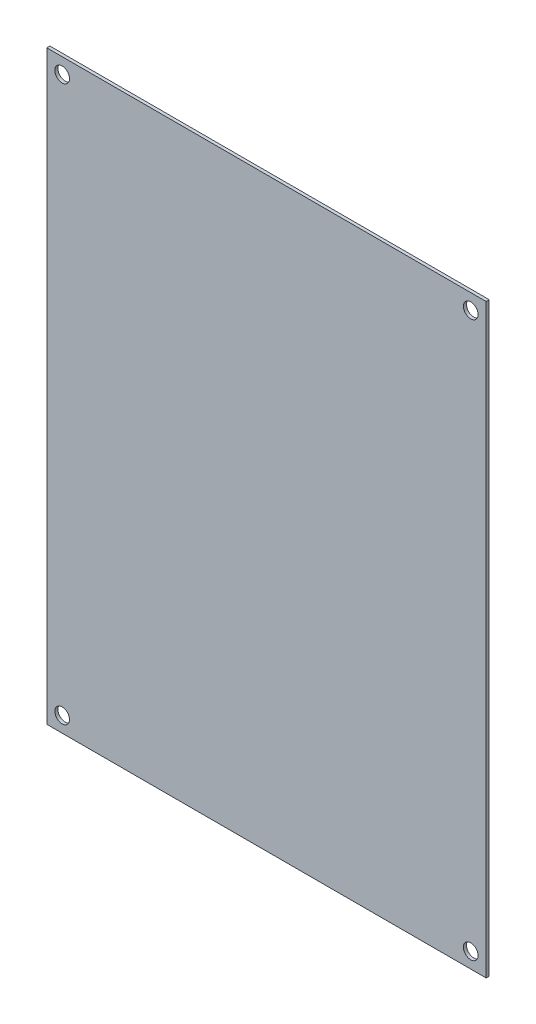
ISO-10303-21;
HEADER;
FILE_DESCRIPTION(('STEP AP214'),'2;1');
FILE_NAME('part.step','',(''),(''),'','','');
FILE_SCHEMA(('AUTOMOTIVE_DESIGN { 1 0 10303 214 1 1 1 1 }'));
ENDSEC;
DATA;
#1=APPLICATION_CONTEXT('core data for automotive mechanical design processes');
#2=APPLICATION_PROTOCOL_DEFINITION('international standard','automotive_design',2000,#1);
#3=PRODUCT_CONTEXT('',#1,'mechanical');
#4=PRODUCT('Part','Part','',(#3));
#5=PRODUCT_RELATED_PRODUCT_CATEGORY('part','',(#4));
#6=PRODUCT_DEFINITION_FORMATION('','',#4);
#7=PRODUCT_DEFINITION_CONTEXT('part definition',#1,'design');
#8=PRODUCT_DEFINITION('design','',#6,#7);
#9=PRODUCT_DEFINITION_SHAPE('','',#8);
#10=(LENGTH_UNIT() NAMED_UNIT(*) SI_UNIT(.MILLI.,.METRE.));
#11=(NAMED_UNIT(*) PLANE_ANGLE_UNIT() SI_UNIT($,.RADIAN.));
#12=(NAMED_UNIT(*) SI_UNIT($,.STERADIAN.) SOLID_ANGLE_UNIT());
#13=UNCERTAINTY_MEASURE_WITH_UNIT(LENGTH_MEASURE(1.E-05),#10,'distance_accuracy_value','');
#14=(GEOMETRIC_REPRESENTATION_CONTEXT(3) GLOBAL_UNCERTAINTY_ASSIGNED_CONTEXT((#13)) GLOBAL_UNIT_ASSIGNED_CONTEXT((#10,
#11,#12)) REPRESENTATION_CONTEXT('',''));
#15=CARTESIAN_POINT('',(0.,0.,0.));
#16=DIRECTION('',(0.,0.,1.));
#17=DIRECTION('',(1.,0.,0.));
#18=AXIS2_PLACEMENT_3D('',#15,#16,#17);
#19=CARTESIAN_POINT('',(205.,408.,2.));
#20=DIRECTION('',(-1.,0.,0.));
#21=DIRECTION('',(0.,-1.,0.));
#22=AXIS2_PLACEMENT_3D('',#19,#20,#21);
#23=PLANE('',#22);
#24=DIRECTION('',(0.,1.,0.));
#25=VECTOR('',#24,1.);
#26=CARTESIAN_POINT('',(205.,408.,0.));
#27=LINE('',#26,#25);
#28=CARTESIAN_POINT('',(205.,28.,0.));
#29=VERTEX_POINT('',#28);
#30=CARTESIAN_POINT('',(205.,408.,0.));
#31=VERTEX_POINT('',#30);
#32=EDGE_CURVE('E98',#29,#31,#27,.T.);
#33=ORIENTED_EDGE('',*,*,#32,.T.);
#34=DIRECTION('',(0.,0.,-1.));
#35=VECTOR('',#34,1.);
#36=CARTESIAN_POINT('',(205.,408.,2.));
#37=LINE('',#36,#35);
#38=CARTESIAN_POINT('',(205.,408.,2.));
#39=VERTEX_POINT('',#38);
#40=EDGE_CURVE('E11',#39,#31,#37,.T.);
#41=ORIENTED_EDGE('',*,*,#40,.F.);
#42=DIRECTION('',(0.,1.,0.));
#43=VECTOR('',#42,1.);
#44=CARTESIAN_POINT('',(205.,408.,2.));
#45=LINE('',#44,#43);
#46=CARTESIAN_POINT('',(205.,28.,2.));
#47=VERTEX_POINT('',#46);
#48=EDGE_CURVE('E85',#47,#39,#45,.T.);
#49=ORIENTED_EDGE('',*,*,#48,.F.);
#50=DIRECTION('',(0.,0.,-1.));
#51=VECTOR('',#50,1.);
#52=CARTESIAN_POINT('',(205.,28.,2.));
#53=LINE('',#52,#51);
#54=EDGE_CURVE('E94',#47,#29,#53,.T.);
#55=ORIENTED_EDGE('',*,*,#54,.T.);
#56=EDGE_LOOP('',(#33,#41,#49,#55));
#57=FACE_BOUND('',#56,.T.);
#58=ADVANCED_FACE('F32',(#57),#23,.F.);
#59=CARTESIAN_POINT('',(-80.,408.,2.));
#60=DIRECTION('',(0.,-1.,0.));
#61=DIRECTION('',(0.,0.,-1.));
#62=AXIS2_PLACEMENT_3D('',#59,#60,#61);
#63=PLANE('',#62);
#64=DIRECTION('',(-1.,0.,0.));
#65=VECTOR('',#64,1.);
#66=CARTESIAN_POINT('',(-80.,408.,0.));
#67=LINE('',#66,#65);
#68=CARTESIAN_POINT('',(-80.,408.,0.));
#69=VERTEX_POINT('',#68);
#70=EDGE_CURVE('E89',#31,#69,#67,.T.);
#71=ORIENTED_EDGE('',*,*,#70,.T.);
#72=DIRECTION('',(0.,0.,-1.));
#73=VECTOR('',#72,1.);
#74=CARTESIAN_POINT('',(-80.,408.,2.));
#75=LINE('',#74,#73);
#76=CARTESIAN_POINT('',(-80.,408.,2.));
#77=VERTEX_POINT('',#76);
#78=EDGE_CURVE('E41',#77,#69,#75,.T.);
#79=ORIENTED_EDGE('',*,*,#78,.F.);
#80=DIRECTION('',(-1.,0.,0.));
#81=VECTOR('',#80,1.);
#82=CARTESIAN_POINT('',(-80.,408.,2.));
#83=LINE('',#82,#81);
#84=EDGE_CURVE('E80',#39,#77,#83,.T.);
#85=ORIENTED_EDGE('',*,*,#84,.F.);
#86=ORIENTED_EDGE('',*,*,#40,.T.);
#87=EDGE_LOOP('',(#71,#79,#85,#86));
#88=FACE_BOUND('',#87,.T.);
#89=ADVANCED_FACE('F88',(#88),#63,.F.);
#90=CARTESIAN_POINT('',(-80.,408.,2.));
#91=DIRECTION('',(1.,0.,0.));
#92=DIRECTION('',(0.,1.,0.));
#93=AXIS2_PLACEMENT_3D('',#90,#91,#92);
#94=PLANE('',#93);
#95=DIRECTION('',(0.,-1.,0.));
#96=VECTOR('',#95,1.);
#97=CARTESIAN_POINT('',(-80.,408.,0.));
#98=LINE('',#97,#96);
#99=CARTESIAN_POINT('',(-79.9999999999999,28.,0.));
#100=VERTEX_POINT('',#99);
#101=EDGE_CURVE('E67',#69,#100,#98,.T.);
#102=ORIENTED_EDGE('',*,*,#101,.T.);
#103=DIRECTION('',(0.,0.,-1.));
#104=VECTOR('',#103,1.);
#105=CARTESIAN_POINT('',(-79.9999999999999,28.,2.));
#106=LINE('',#105,#104);
#107=CARTESIAN_POINT('',(-79.9999999999999,28.,2.));
#108=VERTEX_POINT('',#107);
#109=EDGE_CURVE('E90',#108,#100,#106,.T.);
#110=ORIENTED_EDGE('',*,*,#109,.F.);
#111=DIRECTION('',(0.,-1.,0.));
#112=VECTOR('',#111,1.);
#113=CARTESIAN_POINT('',(-80.,408.,2.));
#114=LINE('',#113,#112);
#115=EDGE_CURVE('E83',#77,#108,#114,.T.);
#116=ORIENTED_EDGE('',*,*,#115,.F.);
#117=ORIENTED_EDGE('',*,*,#78,.T.);
#118=EDGE_LOOP('',(#102,#110,#116,#117));
#119=FACE_BOUND('',#118,.T.);
#120=ADVANCED_FACE('F92',(#119),#94,.F.);
#121=CARTESIAN_POINT('',(-79.9999999999999,28.,2.));
#122=DIRECTION('',(0.,1.,0.));
#123=DIRECTION('',(0.,0.,1.));
#124=AXIS2_PLACEMENT_3D('',#121,#122,#123);
#125=PLANE('',#124);
#126=DIRECTION('',(1.,0.,0.));
#127=VECTOR('',#126,1.);
#128=CARTESIAN_POINT('',(-79.9999999999999,28.,0.));
#129=LINE('',#128,#127);
#130=EDGE_CURVE('E73',#100,#29,#129,.T.);
#131=ORIENTED_EDGE('',*,*,#130,.T.);
#132=ORIENTED_EDGE('',*,*,#54,.F.);
#133=DIRECTION('',(1.,0.,0.));
#134=VECTOR('',#133,1.);
#135=CARTESIAN_POINT('',(-79.9999999999999,28.,2.));
#136=LINE('',#135,#134);
#137=EDGE_CURVE('E50',#108,#47,#136,.T.);
#138=ORIENTED_EDGE('',*,*,#137,.F.);
#139=ORIENTED_EDGE('',*,*,#109,.T.);
#140=EDGE_LOOP('',(#131,#132,#138,#139));
#141=FACE_BOUND('',#140,.T.);
#142=ADVANCED_FACE('F140',(#141),#125,.F.);
#143=CARTESIAN_POINT('',(0.,0.,2.));
#144=DIRECTION('',(0.,0.,1.));
#145=DIRECTION('',(1.,0.,0.));
#146=AXIS2_PLACEMENT_3D('',#143,#144,#145);
#147=PLANE('',#146);
#148=CARTESIAN_POINT('',(195.,398.,2.));
#149=DIRECTION('',(0.,0.,1.));
#150=DIRECTION('',(-1.,0.,0.));
#151=AXIS2_PLACEMENT_3D('',#148,#149,#150);
#152=CIRCLE('',#151,4.76250000000001);
#153=CARTESIAN_POINT('',(190.2375,398.,2.));
#154=VERTEX_POINT('',#153);
#155=EDGE_CURVE('E113',#154,#154,#152,.T.);
#156=ORIENTED_EDGE('',*,*,#155,.F.);
#157=EDGE_LOOP('',(#156));
#158=FACE_BOUND('',#157,.T.);
#159=CARTESIAN_POINT('',(195.,38.,2.));
#160=DIRECTION('',(0.,0.,1.));
#161=DIRECTION('',(1.,0.,0.));
#162=AXIS2_PLACEMENT_3D('',#159,#160,#161);
#163=CIRCLE('',#162,4.76250000000001);
#164=CARTESIAN_POINT('',(199.7625,38.,2.));
#165=VERTEX_POINT('',#164);
#166=EDGE_CURVE('E128',#165,#165,#163,.T.);
#167=ORIENTED_EDGE('',*,*,#166,.F.);
#168=EDGE_LOOP('',(#167));
#169=FACE_BOUND('',#168,.T.);
#170=CARTESIAN_POINT('',(-70.,38.,2.));
#171=DIRECTION('',(0.,0.,1.));
#172=DIRECTION('',(-1.,0.,0.));
#173=AXIS2_PLACEMENT_3D('',#170,#171,#172);
#174=CIRCLE('',#173,4.7625);
#175=CARTESIAN_POINT('',(-74.7625,38.,2.));
#176=VERTEX_POINT('',#175);
#177=EDGE_CURVE('E125',#176,#176,#174,.T.);
#178=ORIENTED_EDGE('',*,*,#177,.F.);
#179=EDGE_LOOP('',(#178));
#180=FACE_BOUND('',#179,.T.);
#181=CARTESIAN_POINT('',(-70.,398.,2.));
#182=DIRECTION('',(0.,0.,1.));
#183=DIRECTION('',(1.,0.,0.));
#184=AXIS2_PLACEMENT_3D('',#181,#182,#183);
#185=CIRCLE('',#184,4.7625);
#186=CARTESIAN_POINT('',(-65.2375,398.,2.));
#187=VERTEX_POINT('',#186);
#188=EDGE_CURVE('E109',#187,#187,#185,.T.);
#189=ORIENTED_EDGE('',*,*,#188,.F.);
#190=EDGE_LOOP('',(#189));
#191=FACE_BOUND('',#190,.T.);
#192=ORIENTED_EDGE('',*,*,#48,.T.);
#193=ORIENTED_EDGE('',*,*,#84,.T.);
#194=ORIENTED_EDGE('',*,*,#115,.T.);
#195=ORIENTED_EDGE('',*,*,#137,.T.);
#196=EDGE_LOOP('',(#192,#193,#194,#195));
#197=FACE_BOUND('',#196,.T.);
#198=ADVANCED_FACE('F81',(#158,#169,#180,#191,#197),#147,.T.);
#199=CARTESIAN_POINT('',(0.,0.,0.));
#200=DIRECTION('',(0.,0.,1.));
#201=DIRECTION('',(1.,0.,0.));
#202=AXIS2_PLACEMENT_3D('',#199,#200,#201);
#203=PLANE('',#202);
#204=CARTESIAN_POINT('',(195.,398.,0.));
#205=DIRECTION('',(0.,0.,1.));
#206=DIRECTION('',(1.,0.,0.));
#207=AXIS2_PLACEMENT_3D('',#204,#205,#206);
#208=CIRCLE('',#207,4.76250000000001);
#209=CARTESIAN_POINT('',(199.7625,398.,0.));
#210=VERTEX_POINT('',#209);
#211=EDGE_CURVE('E35',#210,#210,#208,.T.);
#212=ORIENTED_EDGE('',*,*,#211,.T.);
#213=EDGE_LOOP('',(#212));
#214=FACE_BOUND('',#213,.T.);
#215=CARTESIAN_POINT('',(195.,38.,0.));
#216=DIRECTION('',(0.,0.,1.));
#217=DIRECTION('',(1.,0.,0.));
#218=AXIS2_PLACEMENT_3D('',#215,#216,#217);
#219=CIRCLE('',#218,4.76250000000001);
#220=CARTESIAN_POINT('',(199.7625,38.,0.));
#221=VERTEX_POINT('',#220);
#222=EDGE_CURVE('E112',#221,#221,#219,.T.);
#223=ORIENTED_EDGE('',*,*,#222,.T.);
#224=EDGE_LOOP('',(#223));
#225=FACE_BOUND('',#224,.T.);
#226=CARTESIAN_POINT('',(-70.,38.,0.));
#227=DIRECTION('',(0.,0.,1.));
#228=DIRECTION('',(1.,0.,0.));
#229=AXIS2_PLACEMENT_3D('',#226,#227,#228);
#230=CIRCLE('',#229,4.7625);
#231=CARTESIAN_POINT('',(-65.2375,38.,0.));
#232=VERTEX_POINT('',#231);
#233=EDGE_CURVE('E110',#232,#232,#230,.T.);
#234=ORIENTED_EDGE('',*,*,#233,.T.);
#235=EDGE_LOOP('',(#234));
#236=FACE_BOUND('',#235,.T.);
#237=CARTESIAN_POINT('',(-70.,398.,0.));
#238=DIRECTION('',(0.,0.,1.));
#239=DIRECTION('',(1.,0.,0.));
#240=AXIS2_PLACEMENT_3D('',#237,#238,#239);
#241=CIRCLE('',#240,4.7625);
#242=CARTESIAN_POINT('',(-65.2375,398.,0.));
#243=VERTEX_POINT('',#242);
#244=EDGE_CURVE('E101',#243,#243,#241,.T.);
#245=ORIENTED_EDGE('',*,*,#244,.T.);
#246=EDGE_LOOP('',(#245));
#247=FACE_BOUND('',#246,.T.);
#248=ORIENTED_EDGE('',*,*,#32,.F.);
#249=ORIENTED_EDGE('',*,*,#130,.F.);
#250=ORIENTED_EDGE('',*,*,#101,.F.);
#251=ORIENTED_EDGE('',*,*,#70,.F.);
#252=EDGE_LOOP('',(#248,#249,#250,#251));
#253=FACE_BOUND('',#252,.T.);
#254=ADVANCED_FACE('F139',(#214,#225,#236,#247,#253),#203,.F.);
#255=CARTESIAN_POINT('',(-70.,398.,-8.));
#256=DIRECTION('',(0.,0.,1.));
#257=DIRECTION('',(1.,0.,0.));
#258=AXIS2_PLACEMENT_3D('',#255,#256,#257);
#259=CYLINDRICAL_SURFACE('',#258,4.7625);
#260=ORIENTED_EDGE('',*,*,#188,.T.);
#261=EDGE_LOOP('',(#260));
#262=FACE_BOUND('',#261,.T.);
#263=ORIENTED_EDGE('',*,*,#244,.F.);
#264=EDGE_LOOP('',(#263));
#265=FACE_BOUND('',#264,.T.);
#266=ADVANCED_FACE('F151',(#262,#265),#259,.F.);
#267=CARTESIAN_POINT('',(-70.,38.,-8.));
#268=DIRECTION('',(0.,0.,1.));
#269=DIRECTION('',(1.,0.,0.));
#270=AXIS2_PLACEMENT_3D('',#267,#268,#269);
#271=CYLINDRICAL_SURFACE('',#270,4.7625);
#272=ORIENTED_EDGE('',*,*,#177,.T.);
#273=EDGE_LOOP('',(#272));
#274=FACE_BOUND('',#273,.T.);
#275=ORIENTED_EDGE('',*,*,#233,.F.);
#276=EDGE_LOOP('',(#275));
#277=FACE_BOUND('',#276,.T.);
#278=ADVANCED_FACE('F147',(#274,#277),#271,.F.);
#279=CARTESIAN_POINT('',(195.,38.,-8.));
#280=DIRECTION('',(0.,0.,1.));
#281=DIRECTION('',(1.,0.,0.));
#282=AXIS2_PLACEMENT_3D('',#279,#280,#281);
#283=CYLINDRICAL_SURFACE('',#282,4.76250000000001);
#284=ORIENTED_EDGE('',*,*,#166,.T.);
#285=EDGE_LOOP('',(#284));
#286=FACE_BOUND('',#285,.T.);
#287=ORIENTED_EDGE('',*,*,#222,.F.);
#288=EDGE_LOOP('',(#287));
#289=FACE_BOUND('',#288,.T.);
#290=ADVANCED_FACE('F150',(#286,#289),#283,.F.);
#291=CARTESIAN_POINT('',(195.,398.,-8.));
#292=DIRECTION('',(0.,0.,1.));
#293=DIRECTION('',(1.,0.,0.));
#294=AXIS2_PLACEMENT_3D('',#291,#292,#293);
#295=CYLINDRICAL_SURFACE('',#294,4.76250000000001);
#296=ORIENTED_EDGE('',*,*,#155,.T.);
#297=EDGE_LOOP('',(#296));
#298=FACE_BOUND('',#297,.T.);
#299=ORIENTED_EDGE('',*,*,#211,.F.);
#300=EDGE_LOOP('',(#299));
#301=FACE_BOUND('',#300,.T.);
#302=ADVANCED_FACE('F134',(#298,#301),#295,.F.);
#303=CLOSED_SHELL('',(#58,#89,#120,#142,#198,#254,#266,#278,#290,#302));
#304=MANIFOLD_SOLID_BREP('B2',#303);
#305=ADVANCED_BREP_SHAPE_REPRESENTATION('',(#18,#304),#14);
#306=SHAPE_DEFINITION_REPRESENTATION(#9,#305);
ENDSEC;
END-ISO-10303-21;
